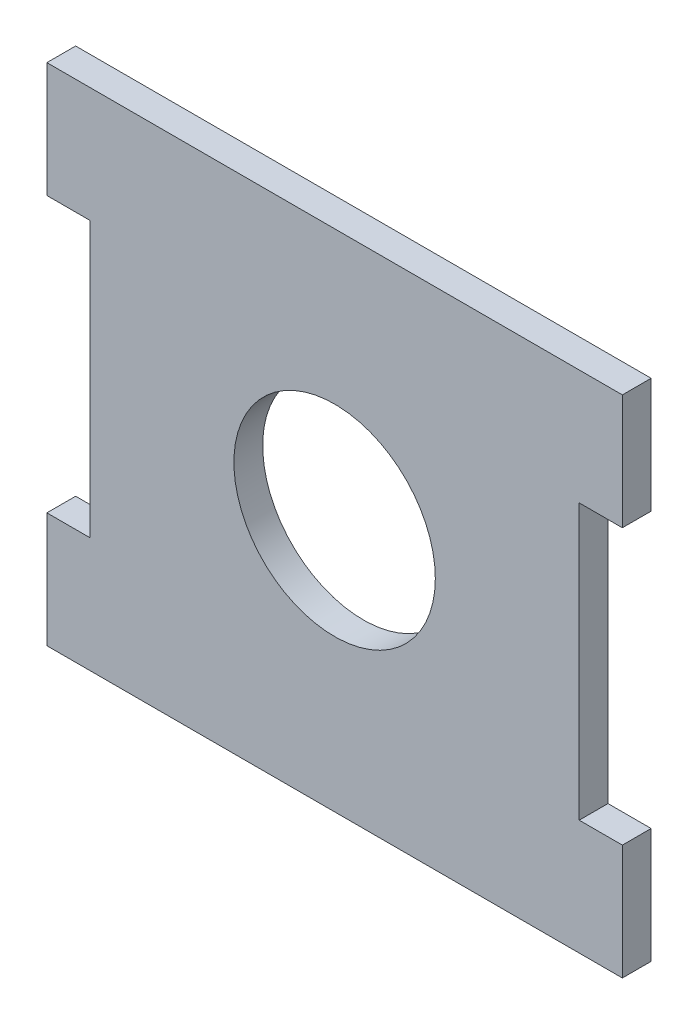
ISO-10303-21;
HEADER;
FILE_DESCRIPTION(('STEP AP214'),'2;1');
FILE_NAME('part.step','',(''),(''),'','','');
FILE_SCHEMA(('AUTOMOTIVE_DESIGN { 1 0 10303 214 1 1 1 1 }'));
ENDSEC;
DATA;
#1=APPLICATION_CONTEXT('core data for automotive mechanical design processes');
#2=APPLICATION_PROTOCOL_DEFINITION('international standard','automotive_design',2000,#1);
#3=PRODUCT_CONTEXT('',#1,'mechanical');
#4=PRODUCT('Part','Part','',(#3));
#5=PRODUCT_RELATED_PRODUCT_CATEGORY('part','',(#4));
#6=PRODUCT_DEFINITION_FORMATION('','',#4);
#7=PRODUCT_DEFINITION_CONTEXT('part definition',#1,'design');
#8=PRODUCT_DEFINITION('design','',#6,#7);
#9=PRODUCT_DEFINITION_SHAPE('','',#8);
#10=(LENGTH_UNIT() NAMED_UNIT(*) SI_UNIT(.MILLI.,.METRE.));
#11=(NAMED_UNIT(*) PLANE_ANGLE_UNIT() SI_UNIT($,.RADIAN.));
#12=(NAMED_UNIT(*) SI_UNIT($,.STERADIAN.) SOLID_ANGLE_UNIT());
#13=UNCERTAINTY_MEASURE_WITH_UNIT(LENGTH_MEASURE(1.E-05),#10,'distance_accuracy_value','');
#14=(GEOMETRIC_REPRESENTATION_CONTEXT(3) GLOBAL_UNCERTAINTY_ASSIGNED_CONTEXT((#13)) GLOBAL_UNIT_ASSIGNED_CONTEXT((#10,
#11,#12)) REPRESENTATION_CONTEXT('',''));
#15=CARTESIAN_POINT('',(0.,0.,0.));
#16=DIRECTION('',(0.,0.,1.));
#17=DIRECTION('',(1.,0.,0.));
#18=AXIS2_PLACEMENT_3D('',#15,#16,#17);
#19=CARTESIAN_POINT('',(0.,0.,2.));
#20=DIRECTION('',(0.,0.,1.));
#21=DIRECTION('',(1.,0.,0.));
#22=AXIS2_PLACEMENT_3D('',#19,#20,#21);
#23=PLANE('',#22);
#24=DIRECTION('',(-1.,0.,0.));
#25=VECTOR('',#24,1.);
#26=CARTESIAN_POINT('',(0.,0.,2.));
#27=LINE('',#26,#25);
#28=CARTESIAN_POINT('',(3.,0.,2.));
#29=VERTEX_POINT('',#28);
#30=CARTESIAN_POINT('',(-37.,0.,2.));
#31=VERTEX_POINT('',#30);
#32=EDGE_CURVE('E50',#29,#31,#27,.T.);
#33=ORIENTED_EDGE('',*,*,#32,.T.);
#34=DIRECTION('',(0.,-1.,0.));
#35=VECTOR('',#34,1.);
#36=CARTESIAN_POINT('',(-37.,0.,2.));
#37=LINE('',#36,#35);
#38=CARTESIAN_POINT('',(-37.,-8.,2.));
#39=VERTEX_POINT('',#38);
#40=EDGE_CURVE('E246',#31,#39,#37,.T.);
#41=ORIENTED_EDGE('',*,*,#40,.T.);
#42=DIRECTION('',(1.,0.,0.));
#43=VECTOR('',#42,1.);
#44=CARTESIAN_POINT('',(-37.,-8.,2.));
#45=LINE('',#44,#43);
#46=CARTESIAN_POINT('',(-34.,-8.,2.));
#47=VERTEX_POINT('',#46);
#48=EDGE_CURVE('E204',#39,#47,#45,.T.);
#49=ORIENTED_EDGE('',*,*,#48,.T.);
#50=DIRECTION('',(0.,-1.,0.));
#51=VECTOR('',#50,1.);
#52=CARTESIAN_POINT('',(-34.,-8.,2.));
#53=LINE('',#52,#51);
#54=CARTESIAN_POINT('',(-34.,-27.1,2.));
#55=VERTEX_POINT('',#54);
#56=EDGE_CURVE('E226',#47,#55,#53,.T.);
#57=ORIENTED_EDGE('',*,*,#56,.T.);
#58=DIRECTION('',(-1.,0.,0.));
#59=VECTOR('',#58,1.);
#60=CARTESIAN_POINT('',(-34.,-27.1,2.));
#61=LINE('',#60,#59);
#62=CARTESIAN_POINT('',(-37.,-27.1,2.));
#63=VERTEX_POINT('',#62);
#64=EDGE_CURVE('E223',#55,#63,#61,.T.);
#65=ORIENTED_EDGE('',*,*,#64,.T.);
#66=DIRECTION('',(0.,-1.,0.));
#67=VECTOR('',#66,1.);
#68=CARTESIAN_POINT('',(-37.,-27.1,2.));
#69=LINE('',#68,#67);
#70=CARTESIAN_POINT('',(-37.,-35.1,2.));
#71=VERTEX_POINT('',#70);
#72=EDGE_CURVE('E225',#63,#71,#69,.T.);
#73=ORIENTED_EDGE('',*,*,#72,.T.);
#74=DIRECTION('',(1.,0.,0.));
#75=VECTOR('',#74,1.);
#76=CARTESIAN_POINT('',(-37.,-35.1,2.));
#77=LINE('',#76,#75);
#78=CARTESIAN_POINT('',(3.,-35.1,2.));
#79=VERTEX_POINT('',#78);
#80=EDGE_CURVE('E228',#71,#79,#77,.T.);
#81=ORIENTED_EDGE('',*,*,#80,.T.);
#82=DIRECTION('',(0.,1.,0.));
#83=VECTOR('',#82,1.);
#84=CARTESIAN_POINT('',(3.,-27.1,2.));
#85=LINE('',#84,#83);
#86=CARTESIAN_POINT('',(3.,-27.1,2.));
#87=VERTEX_POINT('',#86);
#88=EDGE_CURVE('E234',#79,#87,#85,.T.);
#89=ORIENTED_EDGE('',*,*,#88,.T.);
#90=DIRECTION('',(-1.,0.,0.));
#91=VECTOR('',#90,1.);
#92=CARTESIAN_POINT('',(0.,-27.1,2.));
#93=LINE('',#92,#91);
#94=CARTESIAN_POINT('',(0.,-27.1,2.));
#95=VERTEX_POINT('',#94);
#96=EDGE_CURVE('E134',#87,#95,#93,.T.);
#97=ORIENTED_EDGE('',*,*,#96,.T.);
#98=DIRECTION('',(0.,1.,0.));
#99=VECTOR('',#98,1.);
#100=CARTESIAN_POINT('',(0.,-8.,2.));
#101=LINE('',#100,#99);
#102=CARTESIAN_POINT('',(0.,-8.,2.));
#103=VERTEX_POINT('',#102);
#104=EDGE_CURVE('E128',#95,#103,#101,.T.);
#105=ORIENTED_EDGE('',*,*,#104,.T.);
#106=DIRECTION('',(1.,0.,0.));
#107=VECTOR('',#106,1.);
#108=CARTESIAN_POINT('',(3.,-8.,2.));
#109=LINE('',#108,#107);
#110=CARTESIAN_POINT('',(3.,-8.,2.));
#111=VERTEX_POINT('',#110);
#112=EDGE_CURVE('E132',#103,#111,#109,.T.);
#113=ORIENTED_EDGE('',*,*,#112,.T.);
#114=DIRECTION('',(0.,1.,0.));
#115=VECTOR('',#114,1.);
#116=CARTESIAN_POINT('',(3.,0.,2.));
#117=LINE('',#116,#115);
#118=EDGE_CURVE('E148',#111,#29,#117,.T.);
#119=ORIENTED_EDGE('',*,*,#118,.T.);
#120=EDGE_LOOP('',(#33,#41,#49,#57,#65,#73,#81,#89,#97,#105,#113,#119));
#121=FACE_BOUND('',#120,.T.);
#122=CARTESIAN_POINT('',(-17.,-17.55,2.));
#123=DIRECTION('',(0.,0.,1.));
#124=DIRECTION('',(1.,0.,0.));
#125=AXIS2_PLACEMENT_3D('',#122,#123,#124);
#126=CIRCLE('',#125,7.);
#127=CARTESIAN_POINT('',(-10.,-17.55,2.));
#128=VERTEX_POINT('',#127);
#129=EDGE_CURVE('E157',#128,#128,#126,.T.);
#130=ORIENTED_EDGE('',*,*,#129,.F.);
#131=EDGE_LOOP('',(#130));
#132=FACE_BOUND('',#131,.T.);
#133=ADVANCED_FACE('F33',(#121,#132),#23,.T.);
#134=CARTESIAN_POINT('',(0.,0.,0.));
#135=DIRECTION('',(0.,0.,1.));
#136=DIRECTION('',(1.,0.,0.));
#137=AXIS2_PLACEMENT_3D('',#134,#135,#136);
#138=PLANE('',#137);
#139=DIRECTION('',(0.,-1.,0.));
#140=VECTOR('',#139,1.);
#141=CARTESIAN_POINT('',(-37.,0.,0.));
#142=LINE('',#141,#140);
#143=CARTESIAN_POINT('',(-37.,0.,0.));
#144=VERTEX_POINT('',#143);
#145=CARTESIAN_POINT('',(-37.,-8.,0.));
#146=VERTEX_POINT('',#145);
#147=EDGE_CURVE('E154',#144,#146,#142,.T.);
#148=ORIENTED_EDGE('',*,*,#147,.F.);
#149=DIRECTION('',(-1.,0.,0.));
#150=VECTOR('',#149,1.);
#151=CARTESIAN_POINT('',(0.,0.,0.));
#152=LINE('',#151,#150);
#153=CARTESIAN_POINT('',(3.,0.,0.));
#154=VERTEX_POINT('',#153);
#155=EDGE_CURVE('E175',#154,#144,#152,.T.);
#156=ORIENTED_EDGE('',*,*,#155,.F.);
#157=DIRECTION('',(0.,1.,0.));
#158=VECTOR('',#157,1.);
#159=CARTESIAN_POINT('',(3.,0.,0.));
#160=LINE('',#159,#158);
#161=CARTESIAN_POINT('',(3.,-8.,0.));
#162=VERTEX_POINT('',#161);
#163=EDGE_CURVE('E99',#162,#154,#160,.T.);
#164=ORIENTED_EDGE('',*,*,#163,.F.);
#165=DIRECTION('',(1.,0.,0.));
#166=VECTOR('',#165,1.);
#167=CARTESIAN_POINT('',(3.,-8.,0.));
#168=LINE('',#167,#166);
#169=CARTESIAN_POINT('',(0.,-8.,0.));
#170=VERTEX_POINT('',#169);
#171=EDGE_CURVE('E92',#170,#162,#168,.T.);
#172=ORIENTED_EDGE('',*,*,#171,.F.);
#173=DIRECTION('',(0.,1.,0.));
#174=VECTOR('',#173,1.);
#175=CARTESIAN_POINT('',(0.,-8.,0.));
#176=LINE('',#175,#174);
#177=CARTESIAN_POINT('',(0.,-27.1,0.));
#178=VERTEX_POINT('',#177);
#179=EDGE_CURVE('E142',#178,#170,#176,.T.);
#180=ORIENTED_EDGE('',*,*,#179,.F.);
#181=DIRECTION('',(-1.,0.,0.));
#182=VECTOR('',#181,1.);
#183=CARTESIAN_POINT('',(0.,-27.1,0.));
#184=LINE('',#183,#182);
#185=CARTESIAN_POINT('',(3.,-27.1,0.));
#186=VERTEX_POINT('',#185);
#187=EDGE_CURVE('E170',#186,#178,#184,.T.);
#188=ORIENTED_EDGE('',*,*,#187,.F.);
#189=DIRECTION('',(0.,1.,0.));
#190=VECTOR('',#189,1.);
#191=CARTESIAN_POINT('',(3.,-27.1,0.));
#192=LINE('',#191,#190);
#193=CARTESIAN_POINT('',(3.,-35.1,0.));
#194=VERTEX_POINT('',#193);
#195=EDGE_CURVE('E168',#194,#186,#192,.T.);
#196=ORIENTED_EDGE('',*,*,#195,.F.);
#197=DIRECTION('',(1.,0.,0.));
#198=VECTOR('',#197,1.);
#199=CARTESIAN_POINT('',(3.,-35.1,0.));
#200=LINE('',#199,#198);
#201=CARTESIAN_POINT('',(-37.,-35.1,0.));
#202=VERTEX_POINT('',#201);
#203=EDGE_CURVE('E166',#202,#194,#200,.T.);
#204=ORIENTED_EDGE('',*,*,#203,.F.);
#205=DIRECTION('',(0.,-1.,0.));
#206=VECTOR('',#205,1.);
#207=CARTESIAN_POINT('',(-37.,-27.1,0.));
#208=LINE('',#207,#206);
#209=CARTESIAN_POINT('',(-37.,-27.1,0.));
#210=VERTEX_POINT('',#209);
#211=EDGE_CURVE('E163',#210,#202,#208,.T.);
#212=ORIENTED_EDGE('',*,*,#211,.F.);
#213=DIRECTION('',(-1.,0.,0.));
#214=VECTOR('',#213,1.);
#215=CARTESIAN_POINT('',(-34.,-27.1,0.));
#216=LINE('',#215,#214);
#217=CARTESIAN_POINT('',(-34.,-27.1,0.));
#218=VERTEX_POINT('',#217);
#219=EDGE_CURVE('E161',#218,#210,#216,.T.);
#220=ORIENTED_EDGE('',*,*,#219,.F.);
#221=DIRECTION('',(0.,-1.,0.));
#222=VECTOR('',#221,1.);
#223=CARTESIAN_POINT('',(-34.,-8.,0.));
#224=LINE('',#223,#222);
#225=CARTESIAN_POINT('',(-34.,-8.,0.));
#226=VERTEX_POINT('',#225);
#227=EDGE_CURVE('E159',#226,#218,#224,.T.);
#228=ORIENTED_EDGE('',*,*,#227,.F.);
#229=DIRECTION('',(1.,0.,0.));
#230=VECTOR('',#229,1.);
#231=CARTESIAN_POINT('',(-37.,-8.,0.));
#232=LINE('',#231,#230);
#233=EDGE_CURVE('E156',#146,#226,#232,.T.);
#234=ORIENTED_EDGE('',*,*,#233,.F.);
#235=EDGE_LOOP('',(#148,#156,#164,#172,#180,#188,#196,#204,#212,#220,#228,#234));
#236=FACE_BOUND('',#235,.T.);
#237=CARTESIAN_POINT('',(-17.,-17.55,0.));
#238=DIRECTION('',(0.,0.,1.));
#239=DIRECTION('',(1.,0.,0.));
#240=AXIS2_PLACEMENT_3D('',#237,#238,#239);
#241=CIRCLE('',#240,7.);
#242=CARTESIAN_POINT('',(-10.,-17.55,0.));
#243=VERTEX_POINT('',#242);
#244=EDGE_CURVE('E250',#243,#243,#241,.T.);
#245=ORIENTED_EDGE('',*,*,#244,.T.);
#246=EDGE_LOOP('',(#245));
#247=FACE_BOUND('',#246,.T.);
#248=ADVANCED_FACE('F210',(#236,#247),#138,.F.);
#249=CARTESIAN_POINT('',(-37.,0.,2.));
#250=DIRECTION('',(1.,0.,0.));
#251=DIRECTION('',(0.,1.,0.));
#252=AXIS2_PLACEMENT_3D('',#249,#250,#251);
#253=PLANE('',#252);
#254=ORIENTED_EDGE('',*,*,#147,.T.);
#255=DIRECTION('',(0.,0.,-1.));
#256=VECTOR('',#255,1.);
#257=CARTESIAN_POINT('',(-37.,-8.,2.));
#258=LINE('',#257,#256);
#259=EDGE_CURVE('E42',#39,#146,#258,.T.);
#260=ORIENTED_EDGE('',*,*,#259,.F.);
#261=ORIENTED_EDGE('',*,*,#40,.F.);
#262=DIRECTION('',(0.,0.,-1.));
#263=VECTOR('',#262,1.);
#264=CARTESIAN_POINT('',(-37.,0.,2.));
#265=LINE('',#264,#263);
#266=EDGE_CURVE('E11',#31,#144,#265,.T.);
#267=ORIENTED_EDGE('',*,*,#266,.T.);
#268=EDGE_LOOP('',(#254,#260,#261,#267));
#269=FACE_BOUND('',#268,.T.);
#270=ADVANCED_FACE('F35',(#269),#253,.F.);
#271=CARTESIAN_POINT('',(-37.,-8.,2.));
#272=DIRECTION('',(0.,1.,0.));
#273=DIRECTION('',(0.,0.,1.));
#274=AXIS2_PLACEMENT_3D('',#271,#272,#273);
#275=PLANE('',#274);
#276=ORIENTED_EDGE('',*,*,#233,.T.);
#277=DIRECTION('',(0.,0.,-1.));
#278=VECTOR('',#277,1.);
#279=CARTESIAN_POINT('',(-34.,-8.,2.));
#280=LINE('',#279,#278);
#281=EDGE_CURVE('E195',#47,#226,#280,.T.);
#282=ORIENTED_EDGE('',*,*,#281,.F.);
#283=ORIENTED_EDGE('',*,*,#48,.F.);
#284=ORIENTED_EDGE('',*,*,#259,.T.);
#285=EDGE_LOOP('',(#276,#282,#283,#284));
#286=FACE_BOUND('',#285,.T.);
#287=ADVANCED_FACE('F202',(#286),#275,.F.);
#288=CARTESIAN_POINT('',(-34.,-8.,2.));
#289=DIRECTION('',(1.,0.,0.));
#290=DIRECTION('',(0.,1.,0.));
#291=AXIS2_PLACEMENT_3D('',#288,#289,#290);
#292=PLANE('',#291);
#293=ORIENTED_EDGE('',*,*,#227,.T.);
#294=DIRECTION('',(0.,0.,-1.));
#295=VECTOR('',#294,1.);
#296=CARTESIAN_POINT('',(-34.,-27.1,2.));
#297=LINE('',#296,#295);
#298=EDGE_CURVE('E192',#55,#218,#297,.T.);
#299=ORIENTED_EDGE('',*,*,#298,.F.);
#300=ORIENTED_EDGE('',*,*,#56,.F.);
#301=ORIENTED_EDGE('',*,*,#281,.T.);
#302=EDGE_LOOP('',(#293,#299,#300,#301));
#303=FACE_BOUND('',#302,.T.);
#304=ADVANCED_FACE('F217',(#303),#292,.F.);
#305=CARTESIAN_POINT('',(-34.,-27.1,2.));
#306=DIRECTION('',(0.,-1.,0.));
#307=DIRECTION('',(0.,0.,-1.));
#308=AXIS2_PLACEMENT_3D('',#305,#306,#307);
#309=PLANE('',#308);
#310=ORIENTED_EDGE('',*,*,#219,.T.);
#311=DIRECTION('',(0.,0.,-1.));
#312=VECTOR('',#311,1.);
#313=CARTESIAN_POINT('',(-37.,-27.1,2.));
#314=LINE('',#313,#312);
#315=EDGE_CURVE('E189',#63,#210,#314,.T.);
#316=ORIENTED_EDGE('',*,*,#315,.F.);
#317=ORIENTED_EDGE('',*,*,#64,.F.);
#318=ORIENTED_EDGE('',*,*,#298,.T.);
#319=EDGE_LOOP('',(#310,#316,#317,#318));
#320=FACE_BOUND('',#319,.T.);
#321=ADVANCED_FACE('F221',(#320),#309,.F.);
#322=CARTESIAN_POINT('',(-37.,-27.1,2.));
#323=DIRECTION('',(1.,0.,0.));
#324=DIRECTION('',(0.,1.,0.));
#325=AXIS2_PLACEMENT_3D('',#322,#323,#324);
#326=PLANE('',#325);
#327=ORIENTED_EDGE('',*,*,#211,.T.);
#328=DIRECTION('',(0.,0.,-1.));
#329=VECTOR('',#328,1.);
#330=CARTESIAN_POINT('',(-37.,-35.1,2.));
#331=LINE('',#330,#329);
#332=EDGE_CURVE('E186',#71,#202,#331,.T.);
#333=ORIENTED_EDGE('',*,*,#332,.F.);
#334=ORIENTED_EDGE('',*,*,#72,.F.);
#335=ORIENTED_EDGE('',*,*,#315,.T.);
#336=EDGE_LOOP('',(#327,#333,#334,#335));
#337=FACE_BOUND('',#336,.T.);
#338=ADVANCED_FACE('F282',(#337),#326,.F.);
#339=CARTESIAN_POINT('',(3.,-35.1,2.));
#340=DIRECTION('',(0.,1.,0.));
#341=DIRECTION('',(0.,0.,1.));
#342=AXIS2_PLACEMENT_3D('',#339,#340,#341);
#343=PLANE('',#342);
#344=ORIENTED_EDGE('',*,*,#203,.T.);
#345=DIRECTION('',(0.,0.,-1.));
#346=VECTOR('',#345,1.);
#347=CARTESIAN_POINT('',(3.,-35.1,2.));
#348=LINE('',#347,#346);
#349=EDGE_CURVE('E183',#79,#194,#348,.T.);
#350=ORIENTED_EDGE('',*,*,#349,.F.);
#351=ORIENTED_EDGE('',*,*,#80,.F.);
#352=ORIENTED_EDGE('',*,*,#332,.T.);
#353=EDGE_LOOP('',(#344,#350,#351,#352));
#354=FACE_BOUND('',#353,.T.);
#355=ADVANCED_FACE('F279',(#354),#343,.F.);
#356=CARTESIAN_POINT('',(3.,-27.1,2.));
#357=DIRECTION('',(-1.,0.,0.));
#358=DIRECTION('',(0.,-1.,0.));
#359=AXIS2_PLACEMENT_3D('',#356,#357,#358);
#360=PLANE('',#359);
#361=ORIENTED_EDGE('',*,*,#195,.T.);
#362=DIRECTION('',(0.,0.,-1.));
#363=VECTOR('',#362,1.);
#364=CARTESIAN_POINT('',(3.,-27.1,2.));
#365=LINE('',#364,#363);
#366=EDGE_CURVE('E180',#87,#186,#365,.T.);
#367=ORIENTED_EDGE('',*,*,#366,.F.);
#368=ORIENTED_EDGE('',*,*,#88,.F.);
#369=ORIENTED_EDGE('',*,*,#349,.T.);
#370=EDGE_LOOP('',(#361,#367,#368,#369));
#371=FACE_BOUND('',#370,.T.);
#372=ADVANCED_FACE('F240',(#371),#360,.F.);
#373=CARTESIAN_POINT('',(0.,-27.1,2.));
#374=DIRECTION('',(0.,-1.,0.));
#375=DIRECTION('',(0.,0.,-1.));
#376=AXIS2_PLACEMENT_3D('',#373,#374,#375);
#377=PLANE('',#376);
#378=ORIENTED_EDGE('',*,*,#187,.T.);
#379=DIRECTION('',(0.,0.,-1.));
#380=VECTOR('',#379,1.);
#381=CARTESIAN_POINT('',(0.,-27.1,2.));
#382=LINE('',#381,#380);
#383=EDGE_CURVE('E143',#95,#178,#382,.T.);
#384=ORIENTED_EDGE('',*,*,#383,.F.);
#385=ORIENTED_EDGE('',*,*,#96,.F.);
#386=ORIENTED_EDGE('',*,*,#366,.T.);
#387=EDGE_LOOP('',(#378,#384,#385,#386));
#388=FACE_BOUND('',#387,.T.);
#389=ADVANCED_FACE('F244',(#388),#377,.F.);
#390=CARTESIAN_POINT('',(0.,-8.,2.));
#391=DIRECTION('',(-1.,0.,0.));
#392=DIRECTION('',(0.,-1.,0.));
#393=AXIS2_PLACEMENT_3D('',#390,#391,#392);
#394=PLANE('',#393);
#395=ORIENTED_EDGE('',*,*,#179,.T.);
#396=DIRECTION('',(0.,0.,-1.));
#397=VECTOR('',#396,1.);
#398=CARTESIAN_POINT('',(0.,-8.,2.));
#399=LINE('',#398,#397);
#400=EDGE_CURVE('E139',#103,#170,#399,.T.);
#401=ORIENTED_EDGE('',*,*,#400,.F.);
#402=ORIENTED_EDGE('',*,*,#104,.F.);
#403=ORIENTED_EDGE('',*,*,#383,.T.);
#404=EDGE_LOOP('',(#395,#401,#402,#403));
#405=FACE_BOUND('',#404,.T.);
#406=ADVANCED_FACE('F140',(#405),#394,.F.);
#407=CARTESIAN_POINT('',(3.,-8.,2.));
#408=DIRECTION('',(0.,1.,0.));
#409=DIRECTION('',(0.,0.,1.));
#410=AXIS2_PLACEMENT_3D('',#407,#408,#409);
#411=PLANE('',#410);
#412=ORIENTED_EDGE('',*,*,#171,.T.);
#413=DIRECTION('',(0.,0.,-1.));
#414=VECTOR('',#413,1.);
#415=CARTESIAN_POINT('',(3.,-8.,2.));
#416=LINE('',#415,#414);
#417=EDGE_CURVE('E144',#111,#162,#416,.T.);
#418=ORIENTED_EDGE('',*,*,#417,.F.);
#419=ORIENTED_EDGE('',*,*,#112,.F.);
#420=ORIENTED_EDGE('',*,*,#400,.T.);
#421=EDGE_LOOP('',(#412,#418,#419,#420));
#422=FACE_BOUND('',#421,.T.);
#423=ADVANCED_FACE('F146',(#422),#411,.F.);
#424=CARTESIAN_POINT('',(3.,0.,2.));
#425=DIRECTION('',(-1.,0.,0.));
#426=DIRECTION('',(0.,-1.,0.));
#427=AXIS2_PLACEMENT_3D('',#424,#425,#426);
#428=PLANE('',#427);
#429=ORIENTED_EDGE('',*,*,#163,.T.);
#430=DIRECTION('',(0.,0.,-1.));
#431=VECTOR('',#430,1.);
#432=CARTESIAN_POINT('',(3.,0.,2.));
#433=LINE('',#432,#431);
#434=EDGE_CURVE('E150',#29,#154,#433,.T.);
#435=ORIENTED_EDGE('',*,*,#434,.F.);
#436=ORIENTED_EDGE('',*,*,#118,.F.);
#437=ORIENTED_EDGE('',*,*,#417,.T.);
#438=EDGE_LOOP('',(#429,#435,#436,#437));
#439=FACE_BOUND('',#438,.T.);
#440=ADVANCED_FACE('F268',(#439),#428,.F.);
#441=CARTESIAN_POINT('',(0.,0.,2.));
#442=DIRECTION('',(0.,-1.,0.));
#443=DIRECTION('',(0.,0.,-1.));
#444=AXIS2_PLACEMENT_3D('',#441,#442,#443);
#445=PLANE('',#444);
#446=ORIENTED_EDGE('',*,*,#155,.T.);
#447=ORIENTED_EDGE('',*,*,#266,.F.);
#448=ORIENTED_EDGE('',*,*,#32,.F.);
#449=ORIENTED_EDGE('',*,*,#434,.T.);
#450=EDGE_LOOP('',(#446,#447,#448,#449));
#451=FACE_BOUND('',#450,.T.);
#452=ADVANCED_FACE('F245',(#451),#445,.F.);
#453=CARTESIAN_POINT('',(-17.,-17.55,2.));
#454=DIRECTION('',(0.,0.,-1.));
#455=DIRECTION('',(-1.,0.,0.));
#456=AXIS2_PLACEMENT_3D('',#453,#454,#455);
#457=CYLINDRICAL_SURFACE('',#456,7.);
#458=ORIENTED_EDGE('',*,*,#129,.T.);
#459=EDGE_LOOP('',(#458));
#460=FACE_BOUND('',#459,.T.);
#461=ORIENTED_EDGE('',*,*,#244,.F.);
#462=EDGE_LOOP('',(#461));
#463=FACE_BOUND('',#462,.T.);
#464=ADVANCED_FACE('F256',(#460,#463),#457,.F.);
#465=CLOSED_SHELL('',(#133,#248,#270,#287,#304,#321,#338,#355,#372,#389,#406,#423,#440,#452,#464));
#466=MANIFOLD_SOLID_BREP('B2',#465);
#467=ADVANCED_BREP_SHAPE_REPRESENTATION('',(#18,#466),#14);
#468=SHAPE_DEFINITION_REPRESENTATION(#9,#467);
ENDSEC;
END-ISO-10303-21;
